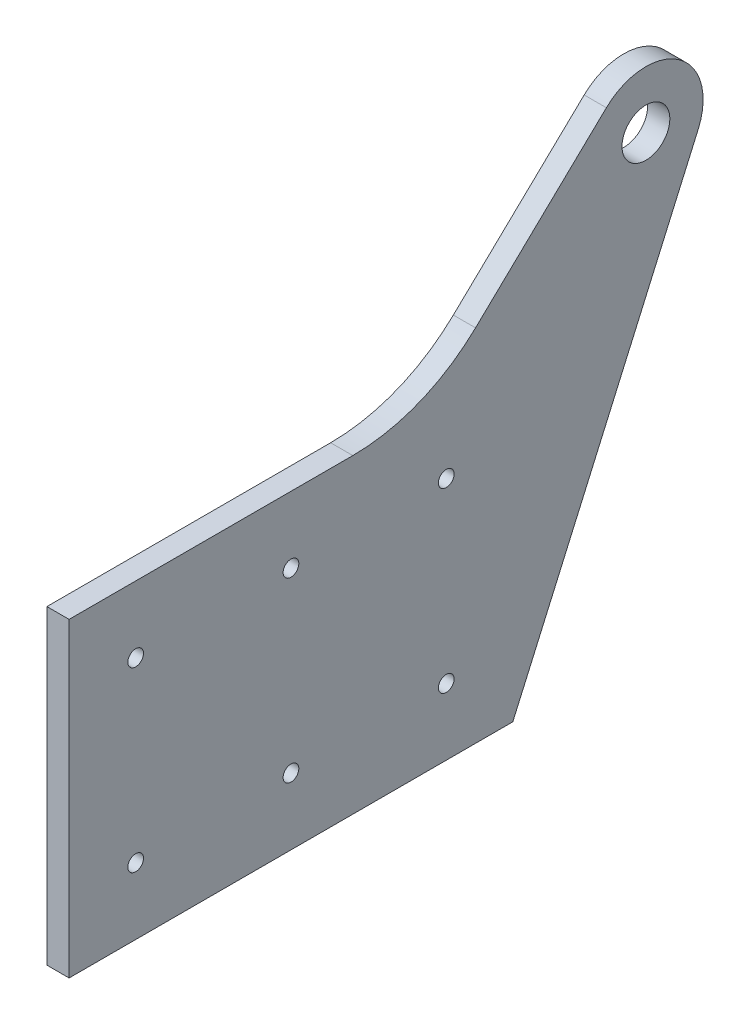
ISO-10303-21;
HEADER;
FILE_DESCRIPTION(('STEP AP214'),'2;1');
FILE_NAME('part.step','',(''),(''),'','','');
FILE_SCHEMA(('AUTOMOTIVE_DESIGN { 1 0 10303 214 1 1 1 1 }'));
ENDSEC;
DATA;
#1=APPLICATION_CONTEXT('core data for automotive mechanical design processes');
#2=APPLICATION_PROTOCOL_DEFINITION('international standard','automotive_design',2000,#1);
#3=PRODUCT_CONTEXT('',#1,'mechanical');
#4=PRODUCT('Part','Part','',(#3));
#5=PRODUCT_RELATED_PRODUCT_CATEGORY('part','',(#4));
#6=PRODUCT_DEFINITION_FORMATION('','',#4);
#7=PRODUCT_DEFINITION_CONTEXT('part definition',#1,'design');
#8=PRODUCT_DEFINITION('design','',#6,#7);
#9=PRODUCT_DEFINITION_SHAPE('','',#8);
#10=(LENGTH_UNIT() NAMED_UNIT(*) SI_UNIT(.MILLI.,.METRE.));
#11=(NAMED_UNIT(*) PLANE_ANGLE_UNIT() SI_UNIT($,.RADIAN.));
#12=(NAMED_UNIT(*) SI_UNIT($,.STERADIAN.) SOLID_ANGLE_UNIT());
#13=UNCERTAINTY_MEASURE_WITH_UNIT(LENGTH_MEASURE(1.E-05),#10,'distance_accuracy_value','');
#14=(GEOMETRIC_REPRESENTATION_CONTEXT(3) GLOBAL_UNCERTAINTY_ASSIGNED_CONTEXT((#13)) GLOBAL_UNIT_ASSIGNED_CONTEXT((#10,
#11,#12)) REPRESENTATION_CONTEXT('',''));
#15=CARTESIAN_POINT('',(0.,0.,0.));
#16=DIRECTION('',(0.,0.,1.));
#17=DIRECTION('',(1.,0.,0.));
#18=AXIS2_PLACEMENT_3D('',#15,#16,#17);
#19=CARTESIAN_POINT('',(12.827,0.,0.));
#20=DIRECTION('',(1.,0.,0.));
#21=DIRECTION('',(0.,0.,-1.));
#22=AXIS2_PLACEMENT_3D('',#19,#20,#21);
#23=PLANE('',#22);
#24=CARTESIAN_POINT('',(12.827,-57.15,146.05));
#25=DIRECTION('',(-1.,0.,0.));
#26=DIRECTION('',(0.,0.,1.));
#27=AXIS2_PLACEMENT_3D('',#24,#25,#26);
#28=CIRCLE('',#27,2.24789999999998);
#29=CARTESIAN_POINT('',(12.827,-57.15,148.2979));
#30=VERTEX_POINT('',#29);
#31=EDGE_CURVE('E214',#30,#30,#28,.T.);
#32=ORIENTED_EDGE('',*,*,#31,.T.);
#33=EDGE_LOOP('',(#32));
#34=FACE_BOUND('',#33,.T.);
#35=CARTESIAN_POINT('',(12.827,-107.95,146.05));
#36=DIRECTION('',(-1.,0.,0.));
#37=DIRECTION('',(0.,0.,1.));
#38=AXIS2_PLACEMENT_3D('',#35,#36,#37);
#39=CIRCLE('',#38,2.24789999999998);
#40=CARTESIAN_POINT('',(12.827,-107.95,148.2979));
#41=VERTEX_POINT('',#40);
#42=EDGE_CURVE('E205',#41,#41,#39,.T.);
#43=ORIENTED_EDGE('',*,*,#42,.T.);
#44=EDGE_LOOP('',(#43));
#45=FACE_BOUND('',#44,.T.);
#46=CARTESIAN_POINT('',(12.827,-107.95,101.6));
#47=DIRECTION('',(-1.,0.,0.));
#48=DIRECTION('',(0.,0.,1.));
#49=AXIS2_PLACEMENT_3D('',#46,#47,#48);
#50=CIRCLE('',#49,2.24789999999998);
#51=CARTESIAN_POINT('',(12.827,-107.95,103.8479));
#52=VERTEX_POINT('',#51);
#53=EDGE_CURVE('E196',#52,#52,#50,.T.);
#54=ORIENTED_EDGE('',*,*,#53,.T.);
#55=EDGE_LOOP('',(#54));
#56=FACE_BOUND('',#55,.T.);
#57=CARTESIAN_POINT('',(12.827,-107.95,57.15));
#58=DIRECTION('',(-1.,0.,0.));
#59=DIRECTION('',(0.,0.,1.));
#60=AXIS2_PLACEMENT_3D('',#57,#58,#59);
#61=CIRCLE('',#60,2.24789999999998);
#62=CARTESIAN_POINT('',(12.827,-107.95,59.3979));
#63=VERTEX_POINT('',#62);
#64=EDGE_CURVE('E187',#63,#63,#61,.T.);
#65=ORIENTED_EDGE('',*,*,#64,.T.);
#66=EDGE_LOOP('',(#65));
#67=FACE_BOUND('',#66,.T.);
#68=CARTESIAN_POINT('',(12.827,-57.15,101.6));
#69=DIRECTION('',(-1.,0.,0.));
#70=DIRECTION('',(0.,0.,1.));
#71=AXIS2_PLACEMENT_3D('',#68,#69,#70);
#72=CIRCLE('',#71,2.24789999999998);
#73=CARTESIAN_POINT('',(12.827,-57.15,103.8479));
#74=VERTEX_POINT('',#73);
#75=EDGE_CURVE('E178',#74,#74,#72,.T.);
#76=ORIENTED_EDGE('',*,*,#75,.T.);
#77=EDGE_LOOP('',(#76));
#78=FACE_BOUND('',#77,.T.);
#79=CARTESIAN_POINT('',(12.827,-57.15,57.15));
#80=DIRECTION('',(-1.,0.,0.));
#81=DIRECTION('',(0.,0.,1.));
#82=AXIS2_PLACEMENT_3D('',#79,#80,#81);
#83=CIRCLE('',#82,2.24789999999998);
#84=CARTESIAN_POINT('',(12.827,-57.15,59.3979));
#85=VERTEX_POINT('',#84);
#86=EDGE_CURVE('E167',#85,#85,#83,.T.);
#87=ORIENTED_EDGE('',*,*,#86,.T.);
#88=EDGE_LOOP('',(#87));
#89=FACE_BOUND('',#88,.T.);
#90=DIRECTION('',(0.,0.915006554161746,-0.403438974122539));
#91=VECTOR('',#90,1.);
#92=CARTESIAN_POINT('',(12.827,-127.,38.1));
#93=LINE('',#92,#91);
#94=CARTESIAN_POINT('',(12.827,-127.,38.1));
#95=VERTEX_POINT('',#94);
#96=CARTESIAN_POINT('',(12.827,-6.60631320125658,-14.9832323243986));
#97=VERTEX_POINT('',#96);
#98=EDGE_CURVE('E140',#95,#97,#93,.T.);
#99=ORIENTED_EDGE('',*,*,#98,.T.);
#100=CARTESIAN_POINT('',(12.827,0.,0.));
#101=DIRECTION('',(1.,0.,0.));
#102=DIRECTION('',(0.,0.,-1.));
#103=AXIS2_PLACEMENT_3D('',#100,#101,#102);
#104=CIRCLE('',#103,16.375);
#105=CARTESIAN_POINT('',(12.827,11.8309066911241,11.3212310225485));
#106=VERTEX_POINT('',#105);
#107=EDGE_CURVE('E93',#97,#106,#104,.T.);
#108=ORIENTED_EDGE('',*,*,#107,.T.);
#109=DIRECTION('',(0.,-0.69137288687319,0.722498118541931));
#110=VECTOR('',#109,1.);
#111=CARTESIAN_POINT('',(12.827,-24.0029044219301,48.7682608394948));
#112=LINE('',#111,#110);
#113=CARTESIAN_POINT('',(12.827,-24.0029044219301,48.7682608394949));
#114=VERTEX_POINT('',#113);
#115=EDGE_CURVE('E152',#106,#114,#112,.T.);
#116=ORIENTED_EDGE('',*,*,#115,.T.);
#117=CARTESIAN_POINT('',(12.827,12.7,83.8900034926529));
#118=DIRECTION('',(-1.,0.,0.));
#119=DIRECTION('',(0.,0.,-1.));
#120=AXIS2_PLACEMENT_3D('',#117,#118,#119);
#121=CIRCLE('',#120,50.8);
#122=CARTESIAN_POINT('',(12.827,-38.1,83.8900034926529));
#123=VERTEX_POINT('',#122);
#124=EDGE_CURVE('E109',#114,#123,#121,.T.);
#125=ORIENTED_EDGE('',*,*,#124,.T.);
#126=DIRECTION('',(0.,0.,1.));
#127=VECTOR('',#126,1.);
#128=CARTESIAN_POINT('',(12.827,-38.1,165.1));
#129=LINE('',#128,#127);
#130=CARTESIAN_POINT('',(12.827,-38.1,165.1));
#131=VERTEX_POINT('',#130);
#132=EDGE_CURVE('E103',#123,#131,#129,.T.);
#133=ORIENTED_EDGE('',*,*,#132,.T.);
#134=DIRECTION('',(0.,-1.,0.));
#135=VECTOR('',#134,1.);
#136=CARTESIAN_POINT('',(12.827,-127.,165.1));
#137=LINE('',#136,#135);
#138=CARTESIAN_POINT('',(12.827,-127.,165.1));
#139=VERTEX_POINT('',#138);
#140=EDGE_CURVE('E107',#131,#139,#137,.T.);
#141=ORIENTED_EDGE('',*,*,#140,.T.);
#142=DIRECTION('',(0.,0.,-1.));
#143=VECTOR('',#142,1.);
#144=CARTESIAN_POINT('',(12.827,-127.,38.1));
#145=LINE('',#144,#143);
#146=EDGE_CURVE('E53',#139,#95,#145,.T.);
#147=ORIENTED_EDGE('',*,*,#146,.T.);
#148=EDGE_LOOP('',(#99,#108,#116,#125,#133,#141,#147));
#149=FACE_BOUND('',#148,.T.);
#150=CARTESIAN_POINT('',(12.827,0.,0.));
#151=DIRECTION('',(1.,0.,0.));
#152=DIRECTION('',(0.,0.,-1.));
#153=AXIS2_PLACEMENT_3D('',#150,#151,#152);
#154=CIRCLE('',#153,6.85);
#155=CARTESIAN_POINT('',(12.827,0.,-6.85));
#156=VERTEX_POINT('',#155);
#157=EDGE_CURVE('E131',#156,#156,#154,.T.);
#158=ORIENTED_EDGE('',*,*,#157,.F.);
#159=EDGE_LOOP('',(#158));
#160=FACE_BOUND('',#159,.T.);
#161=ADVANCED_FACE('F36',(#34,#45,#56,#67,#78,#89,#149,#160),#23,.T.);
#162=CARTESIAN_POINT('',(6.477,0.,0.));
#163=DIRECTION('',(1.,0.,0.));
#164=DIRECTION('',(0.,0.,-1.));
#165=AXIS2_PLACEMENT_3D('',#162,#163,#164);
#166=PLANE('',#165);
#167=CARTESIAN_POINT('',(6.477,-57.15,146.05));
#168=DIRECTION('',(-1.,0.,0.));
#169=DIRECTION('',(0.,0.,1.));
#170=AXIS2_PLACEMENT_3D('',#167,#168,#169);
#171=CIRCLE('',#170,4.2164);
#172=CARTESIAN_POINT('',(6.477,-57.15,150.2664));
#173=VERTEX_POINT('',#172);
#174=EDGE_CURVE('E220',#173,#173,#171,.T.);
#175=ORIENTED_EDGE('',*,*,#174,.F.);
#176=EDGE_LOOP('',(#175));
#177=FACE_BOUND('',#176,.T.);
#178=CARTESIAN_POINT('',(6.477,-107.95,146.05));
#179=DIRECTION('',(-1.,0.,0.));
#180=DIRECTION('',(0.,0.,1.));
#181=AXIS2_PLACEMENT_3D('',#178,#179,#180);
#182=CIRCLE('',#181,4.21639999999999);
#183=CARTESIAN_POINT('',(6.477,-107.95,150.2664));
#184=VERTEX_POINT('',#183);
#185=EDGE_CURVE('E211',#184,#184,#182,.T.);
#186=ORIENTED_EDGE('',*,*,#185,.F.);
#187=EDGE_LOOP('',(#186));
#188=FACE_BOUND('',#187,.T.);
#189=CARTESIAN_POINT('',(6.477,-107.95,101.6));
#190=DIRECTION('',(-1.,0.,0.));
#191=DIRECTION('',(0.,0.,1.));
#192=AXIS2_PLACEMENT_3D('',#189,#190,#191);
#193=CIRCLE('',#192,4.21639999999999);
#194=CARTESIAN_POINT('',(6.477,-107.95,105.8164));
#195=VERTEX_POINT('',#194);
#196=EDGE_CURVE('E202',#195,#195,#193,.T.);
#197=ORIENTED_EDGE('',*,*,#196,.F.);
#198=EDGE_LOOP('',(#197));
#199=FACE_BOUND('',#198,.T.);
#200=CARTESIAN_POINT('',(6.477,-107.95,57.15));
#201=DIRECTION('',(-1.,0.,0.));
#202=DIRECTION('',(0.,0.,1.));
#203=AXIS2_PLACEMENT_3D('',#200,#201,#202);
#204=CIRCLE('',#203,4.21639999999999);
#205=CARTESIAN_POINT('',(6.477,-107.95,61.3664));
#206=VERTEX_POINT('',#205);
#207=EDGE_CURVE('E193',#206,#206,#204,.T.);
#208=ORIENTED_EDGE('',*,*,#207,.F.);
#209=EDGE_LOOP('',(#208));
#210=FACE_BOUND('',#209,.T.);
#211=CARTESIAN_POINT('',(6.477,-57.15,101.6));
#212=DIRECTION('',(-1.,0.,0.));
#213=DIRECTION('',(0.,0.,1.));
#214=AXIS2_PLACEMENT_3D('',#211,#212,#213);
#215=CIRCLE('',#214,4.2164);
#216=CARTESIAN_POINT('',(6.477,-57.15,105.8164));
#217=VERTEX_POINT('',#216);
#218=EDGE_CURVE('E184',#217,#217,#215,.T.);
#219=ORIENTED_EDGE('',*,*,#218,.F.);
#220=EDGE_LOOP('',(#219));
#221=FACE_BOUND('',#220,.T.);
#222=CARTESIAN_POINT('',(6.477,-57.15,57.15));
#223=DIRECTION('',(-1.,0.,0.));
#224=DIRECTION('',(0.,0.,1.));
#225=AXIS2_PLACEMENT_3D('',#222,#223,#224);
#226=CIRCLE('',#225,4.2164);
#227=CARTESIAN_POINT('',(6.477,-57.15,61.3664));
#228=VERTEX_POINT('',#227);
#229=EDGE_CURVE('E175',#228,#228,#226,.T.);
#230=ORIENTED_EDGE('',*,*,#229,.F.);
#231=EDGE_LOOP('',(#230));
#232=FACE_BOUND('',#231,.T.);
#233=DIRECTION('',(0.,0.915006554161746,-0.403438974122539));
#234=VECTOR('',#233,1.);
#235=CARTESIAN_POINT('',(6.477,-127.,38.1));
#236=LINE('',#235,#234);
#237=CARTESIAN_POINT('',(6.477,-127.,38.1));
#238=VERTEX_POINT('',#237);
#239=CARTESIAN_POINT('',(6.477,-6.60631320125658,-14.9832323243986));
#240=VERTEX_POINT('',#239);
#241=EDGE_CURVE('E127',#238,#240,#236,.T.);
#242=ORIENTED_EDGE('',*,*,#241,.F.);
#243=DIRECTION('',(0.,0.,-1.));
#244=VECTOR('',#243,1.);
#245=CARTESIAN_POINT('',(6.477,-127.,38.1));
#246=LINE('',#245,#244);
#247=CARTESIAN_POINT('',(6.477,-127.,165.1));
#248=VERTEX_POINT('',#247);
#249=EDGE_CURVE('E85',#248,#238,#246,.T.);
#250=ORIENTED_EDGE('',*,*,#249,.F.);
#251=DIRECTION('',(0.,-1.,0.));
#252=VECTOR('',#251,1.);
#253=CARTESIAN_POINT('',(6.477,-127.,165.1));
#254=LINE('',#253,#252);
#255=CARTESIAN_POINT('',(6.477,-38.1,165.1));
#256=VERTEX_POINT('',#255);
#257=EDGE_CURVE('E79',#256,#248,#254,.T.);
#258=ORIENTED_EDGE('',*,*,#257,.F.);
#259=DIRECTION('',(0.,0.,1.));
#260=VECTOR('',#259,1.);
#261=CARTESIAN_POINT('',(6.477,-38.1,165.1));
#262=LINE('',#261,#260);
#263=CARTESIAN_POINT('',(6.477,-38.1,83.8900034926529));
#264=VERTEX_POINT('',#263);
#265=EDGE_CURVE('E117',#264,#256,#262,.T.);
#266=ORIENTED_EDGE('',*,*,#265,.F.);
#267=CARTESIAN_POINT('',(6.477,12.7,83.8900034926529));
#268=DIRECTION('',(-1.,0.,0.));
#269=DIRECTION('',(0.,0.,-1.));
#270=AXIS2_PLACEMENT_3D('',#267,#268,#269);
#271=CIRCLE('',#270,50.8);
#272=CARTESIAN_POINT('',(6.477,-24.0029044219301,48.7682608394949));
#273=VERTEX_POINT('',#272);
#274=EDGE_CURVE('E135',#273,#264,#271,.T.);
#275=ORIENTED_EDGE('',*,*,#274,.F.);
#276=DIRECTION('',(0.,-0.69137288687319,0.722498118541931));
#277=VECTOR('',#276,1.);
#278=CARTESIAN_POINT('',(6.477,-24.0029044219301,48.7682608394948));
#279=LINE('',#278,#277);
#280=CARTESIAN_POINT('',(6.477,11.8309066911241,11.3212310225485));
#281=VERTEX_POINT('',#280);
#282=EDGE_CURVE('E133',#281,#273,#279,.T.);
#283=ORIENTED_EDGE('',*,*,#282,.F.);
#284=CARTESIAN_POINT('',(6.477,0.,0.));
#285=DIRECTION('',(1.,0.,0.));
#286=DIRECTION('',(0.,0.,-1.));
#287=AXIS2_PLACEMENT_3D('',#284,#285,#286);
#288=CIRCLE('',#287,16.375);
#289=EDGE_CURVE('E130',#240,#281,#288,.T.);
#290=ORIENTED_EDGE('',*,*,#289,.F.);
#291=EDGE_LOOP('',(#242,#250,#258,#266,#275,#283,#290));
#292=FACE_BOUND('',#291,.T.);
#293=CARTESIAN_POINT('',(6.477,0.,0.));
#294=DIRECTION('',(1.,0.,0.));
#295=DIRECTION('',(0.,0.,-1.));
#296=AXIS2_PLACEMENT_3D('',#293,#294,#295);
#297=CIRCLE('',#296,6.85);
#298=CARTESIAN_POINT('',(6.477,0.,-6.85));
#299=VERTEX_POINT('',#298);
#300=EDGE_CURVE('E164',#299,#299,#297,.T.);
#301=ORIENTED_EDGE('',*,*,#300,.T.);
#302=EDGE_LOOP('',(#301));
#303=FACE_BOUND('',#302,.T.);
#304=ADVANCED_FACE('F156',(#177,#188,#199,#210,#221,#232,#292,#303),#166,.F.);
#305=CARTESIAN_POINT('',(12.827,-127.,38.1));
#306=DIRECTION('',(0.,0.403438974122539,0.915006554161746));
#307=DIRECTION('',(0.,-0.915006554161746,0.40343897412254));
#308=AXIS2_PLACEMENT_3D('',#305,#306,#307);
#309=PLANE('',#308);
#310=ORIENTED_EDGE('',*,*,#241,.T.);
#311=DIRECTION('',(-1.,0.,0.));
#312=VECTOR('',#311,1.);
#313=CARTESIAN_POINT('',(12.827,-6.60631320125658,-14.9832323243986));
#314=LINE('',#313,#312);
#315=EDGE_CURVE('E11',#97,#240,#314,.T.);
#316=ORIENTED_EDGE('',*,*,#315,.F.);
#317=ORIENTED_EDGE('',*,*,#98,.F.);
#318=DIRECTION('',(-1.,0.,0.));
#319=VECTOR('',#318,1.);
#320=CARTESIAN_POINT('',(12.827,-127.,38.1));
#321=LINE('',#320,#319);
#322=EDGE_CURVE('E123',#95,#238,#321,.T.);
#323=ORIENTED_EDGE('',*,*,#322,.T.);
#324=EDGE_LOOP('',(#310,#316,#317,#323));
#325=FACE_BOUND('',#324,.T.);
#326=ADVANCED_FACE('F38',(#325),#309,.F.);
#327=CARTESIAN_POINT('',(12.827,0.,0.));
#328=DIRECTION('',(-1.,0.,0.));
#329=DIRECTION('',(0.,0.,1.));
#330=AXIS2_PLACEMENT_3D('',#327,#328,#329);
#331=CYLINDRICAL_SURFACE('',#330,16.375);
#332=ORIENTED_EDGE('',*,*,#289,.T.);
#333=DIRECTION('',(-1.,0.,0.));
#334=VECTOR('',#333,1.);
#335=CARTESIAN_POINT('',(12.827,11.8309066911241,11.3212310225485));
#336=LINE('',#335,#334);
#337=EDGE_CURVE('E45',#106,#281,#336,.T.);
#338=ORIENTED_EDGE('',*,*,#337,.F.);
#339=ORIENTED_EDGE('',*,*,#107,.F.);
#340=ORIENTED_EDGE('',*,*,#315,.T.);
#341=EDGE_LOOP('',(#332,#338,#339,#340));
#342=FACE_BOUND('',#341,.T.);
#343=ADVANCED_FACE('F274',(#342),#331,.T.);
#344=CARTESIAN_POINT('',(12.827,-24.0029044219301,48.7682608394948));
#345=DIRECTION('',(0.,-0.722498118541932,-0.69137288687319));
#346=DIRECTION('',(0.,0.69137288687319,-0.722498118541932));
#347=AXIS2_PLACEMENT_3D('',#344,#345,#346);
#348=PLANE('',#347);
#349=ORIENTED_EDGE('',*,*,#282,.T.);
#350=DIRECTION('',(-1.,0.,0.));
#351=VECTOR('',#350,1.);
#352=CARTESIAN_POINT('',(12.827,-24.0029044219301,48.7682608394949));
#353=LINE('',#352,#351);
#354=EDGE_CURVE('E144',#114,#273,#353,.T.);
#355=ORIENTED_EDGE('',*,*,#354,.F.);
#356=ORIENTED_EDGE('',*,*,#115,.F.);
#357=ORIENTED_EDGE('',*,*,#337,.T.);
#358=EDGE_LOOP('',(#349,#355,#356,#357));
#359=FACE_BOUND('',#358,.T.);
#360=ADVANCED_FACE('F150',(#359),#348,.F.);
#361=CARTESIAN_POINT('',(12.827,12.7,83.8900034926529));
#362=DIRECTION('',(-1.,0.,0.));
#363=DIRECTION('',(0.,0.,1.));
#364=AXIS2_PLACEMENT_3D('',#361,#362,#363);
#365=CYLINDRICAL_SURFACE('',#364,50.8);
#366=ORIENTED_EDGE('',*,*,#274,.T.);
#367=DIRECTION('',(-1.,0.,0.));
#368=VECTOR('',#367,1.);
#369=CARTESIAN_POINT('',(12.827,-38.1,83.8900034926529));
#370=LINE('',#369,#368);
#371=EDGE_CURVE('E118',#123,#264,#370,.T.);
#372=ORIENTED_EDGE('',*,*,#371,.F.);
#373=ORIENTED_EDGE('',*,*,#124,.F.);
#374=ORIENTED_EDGE('',*,*,#354,.T.);
#375=EDGE_LOOP('',(#366,#372,#373,#374));
#376=FACE_BOUND('',#375,.T.);
#377=ADVANCED_FACE('F159',(#376),#365,.F.);
#378=CARTESIAN_POINT('',(12.827,-38.1,165.1));
#379=DIRECTION('',(0.,-1.,0.));
#380=DIRECTION('',(0.,0.,-1.));
#381=AXIS2_PLACEMENT_3D('',#378,#379,#380);
#382=PLANE('',#381);
#383=ORIENTED_EDGE('',*,*,#265,.T.);
#384=DIRECTION('',(-1.,0.,0.));
#385=VECTOR('',#384,1.);
#386=CARTESIAN_POINT('',(12.827,-38.1,165.1));
#387=LINE('',#386,#385);
#388=EDGE_CURVE('E114',#131,#256,#387,.T.);
#389=ORIENTED_EDGE('',*,*,#388,.F.);
#390=ORIENTED_EDGE('',*,*,#132,.F.);
#391=ORIENTED_EDGE('',*,*,#371,.T.);
#392=EDGE_LOOP('',(#383,#389,#390,#391));
#393=FACE_BOUND('',#392,.T.);
#394=ADVANCED_FACE('F115',(#393),#382,.F.);
#395=CARTESIAN_POINT('',(12.827,-127.,165.1));
#396=DIRECTION('',(0.,0.,-1.));
#397=DIRECTION('',(-1.,0.,0.));
#398=AXIS2_PLACEMENT_3D('',#395,#396,#397);
#399=PLANE('',#398);
#400=ORIENTED_EDGE('',*,*,#257,.T.);
#401=DIRECTION('',(-1.,0.,0.));
#402=VECTOR('',#401,1.);
#403=CARTESIAN_POINT('',(12.827,-127.,165.1));
#404=LINE('',#403,#402);
#405=EDGE_CURVE('E119',#139,#248,#404,.T.);
#406=ORIENTED_EDGE('',*,*,#405,.F.);
#407=ORIENTED_EDGE('',*,*,#140,.F.);
#408=ORIENTED_EDGE('',*,*,#388,.T.);
#409=EDGE_LOOP('',(#400,#406,#407,#408));
#410=FACE_BOUND('',#409,.T.);
#411=ADVANCED_FACE('F121',(#410),#399,.F.);
#412=CARTESIAN_POINT('',(12.827,-127.,38.1));
#413=DIRECTION('',(0.,1.,0.));
#414=DIRECTION('',(0.,0.,1.));
#415=AXIS2_PLACEMENT_3D('',#412,#413,#414);
#416=PLANE('',#415);
#417=ORIENTED_EDGE('',*,*,#249,.T.);
#418=ORIENTED_EDGE('',*,*,#322,.F.);
#419=ORIENTED_EDGE('',*,*,#146,.F.);
#420=ORIENTED_EDGE('',*,*,#405,.T.);
#421=EDGE_LOOP('',(#417,#418,#419,#420));
#422=FACE_BOUND('',#421,.T.);
#423=ADVANCED_FACE('F264',(#422),#416,.F.);
#424=CARTESIAN_POINT('',(12.827,0.,0.));
#425=DIRECTION('',(-1.,0.,0.));
#426=DIRECTION('',(0.,0.,1.));
#427=AXIS2_PLACEMENT_3D('',#424,#425,#426);
#428=CYLINDRICAL_SURFACE('',#427,6.85);
#429=ORIENTED_EDGE('',*,*,#157,.T.);
#430=EDGE_LOOP('',(#429));
#431=FACE_BOUND('',#430,.T.);
#432=ORIENTED_EDGE('',*,*,#300,.F.);
#433=EDGE_LOOP('',(#432));
#434=FACE_BOUND('',#433,.T.);
#435=ADVANCED_FACE('F252',(#431,#434),#428,.F.);
#436=CARTESIAN_POINT('',(6.477,-57.15,57.15));
#437=DIRECTION('',(-1.,0.,0.));
#438=DIRECTION('',(0.,0.,1.));
#439=AXIS2_PLACEMENT_3D('',#436,#437,#438);
#440=CYLINDRICAL_SURFACE('',#439,2.24789999999999);
#441=ORIENTED_EDGE('',*,*,#86,.F.);
#442=EDGE_LOOP('',(#441));
#443=FACE_BOUND('',#442,.T.);
#444=CARTESIAN_POINT('',(8.12876762397248,-57.15,57.15));
#445=DIRECTION('',(-1.,0.,0.));
#446=DIRECTION('',(0.,0.,1.));
#447=AXIS2_PLACEMENT_3D('',#444,#445,#446);
#448=CIRCLE('',#447,2.2479);
#449=CARTESIAN_POINT('',(8.12876762397248,-57.15,59.3979));
#450=VERTEX_POINT('',#449);
#451=EDGE_CURVE('E172',#450,#450,#448,.T.);
#452=ORIENTED_EDGE('',*,*,#451,.T.);
#453=EDGE_LOOP('',(#452));
#454=FACE_BOUND('',#453,.T.);
#455=ADVANCED_FACE('F242',(#443,#454),#440,.F.);
#456=CARTESIAN_POINT('',(6.477,-57.15,57.15));
#457=DIRECTION('',(-1.,0.,0.));
#458=DIRECTION('',(0.,0.,1.));
#459=AXIS2_PLACEMENT_3D('',#456,#457,#458);
#460=CONICAL_SURFACE('',#459,4.2164,0.872664625997165);
#461=ORIENTED_EDGE('',*,*,#451,.F.);
#462=EDGE_LOOP('',(#461));
#463=FACE_BOUND('',#462,.T.);
#464=ORIENTED_EDGE('',*,*,#229,.T.);
#465=EDGE_LOOP('',(#464));
#466=FACE_BOUND('',#465,.T.);
#467=ADVANCED_FACE('F239',(#463,#466),#460,.F.);
#468=CARTESIAN_POINT('',(6.477,-57.15,101.6));
#469=DIRECTION('',(-1.,0.,0.));
#470=DIRECTION('',(0.,0.,1.));
#471=AXIS2_PLACEMENT_3D('',#468,#469,#470);
#472=CYLINDRICAL_SURFACE('',#471,2.24789999999999);
#473=ORIENTED_EDGE('',*,*,#75,.F.);
#474=EDGE_LOOP('',(#473));
#475=FACE_BOUND('',#474,.T.);
#476=CARTESIAN_POINT('',(8.12876762397248,-57.15,101.6));
#477=DIRECTION('',(-1.,0.,0.));
#478=DIRECTION('',(0.,0.,1.));
#479=AXIS2_PLACEMENT_3D('',#476,#477,#478);
#480=CIRCLE('',#479,2.2479);
#481=CARTESIAN_POINT('',(8.12876762397248,-57.15,103.8479));
#482=VERTEX_POINT('',#481);
#483=EDGE_CURVE('E181',#482,#482,#480,.T.);
#484=ORIENTED_EDGE('',*,*,#483,.T.);
#485=EDGE_LOOP('',(#484));
#486=FACE_BOUND('',#485,.T.);
#487=ADVANCED_FACE('F241',(#475,#486),#472,.F.);
#488=CARTESIAN_POINT('',(6.477,-57.15,101.6));
#489=DIRECTION('',(-1.,0.,0.));
#490=DIRECTION('',(0.,0.,1.));
#491=AXIS2_PLACEMENT_3D('',#488,#489,#490);
#492=CONICAL_SURFACE('',#491,4.2164,0.872664625997165);
#493=ORIENTED_EDGE('',*,*,#483,.F.);
#494=EDGE_LOOP('',(#493));
#495=FACE_BOUND('',#494,.T.);
#496=ORIENTED_EDGE('',*,*,#218,.T.);
#497=EDGE_LOOP('',(#496));
#498=FACE_BOUND('',#497,.T.);
#499=ADVANCED_FACE('F249',(#495,#498),#492,.F.);
#500=CARTESIAN_POINT('',(6.477,-107.95,57.15));
#501=DIRECTION('',(-1.,0.,0.));
#502=DIRECTION('',(0.,0.,1.));
#503=AXIS2_PLACEMENT_3D('',#500,#501,#502);
#504=CYLINDRICAL_SURFACE('',#503,2.24789999999999);
#505=ORIENTED_EDGE('',*,*,#64,.F.);
#506=EDGE_LOOP('',(#505));
#507=FACE_BOUND('',#506,.T.);
#508=CARTESIAN_POINT('',(8.12876762397248,-107.95,57.15));
#509=DIRECTION('',(-1.,0.,0.));
#510=DIRECTION('',(0.,0.,1.));
#511=AXIS2_PLACEMENT_3D('',#508,#509,#510);
#512=CIRCLE('',#511,2.2479);
#513=CARTESIAN_POINT('',(8.12876762397248,-107.95,59.3979));
#514=VERTEX_POINT('',#513);
#515=EDGE_CURVE('E190',#514,#514,#512,.T.);
#516=ORIENTED_EDGE('',*,*,#515,.T.);
#517=EDGE_LOOP('',(#516));
#518=FACE_BOUND('',#517,.T.);
#519=ADVANCED_FACE('F344',(#507,#518),#504,.F.);
#520=CARTESIAN_POINT('',(6.477,-107.95,57.15));
#521=DIRECTION('',(-1.,0.,0.));
#522=DIRECTION('',(0.,0.,1.));
#523=AXIS2_PLACEMENT_3D('',#520,#521,#522);
#524=CONICAL_SURFACE('',#523,4.21639999999999,0.872664625997163);
#525=ORIENTED_EDGE('',*,*,#515,.F.);
#526=EDGE_LOOP('',(#525));
#527=FACE_BOUND('',#526,.T.);
#528=ORIENTED_EDGE('',*,*,#207,.T.);
#529=EDGE_LOOP('',(#528));
#530=FACE_BOUND('',#529,.T.);
#531=ADVANCED_FACE('F354',(#527,#530),#524,.F.);
#532=CARTESIAN_POINT('',(6.477,-107.95,101.6));
#533=DIRECTION('',(-1.,0.,0.));
#534=DIRECTION('',(0.,0.,1.));
#535=AXIS2_PLACEMENT_3D('',#532,#533,#534);
#536=CYLINDRICAL_SURFACE('',#535,2.24789999999999);
#537=ORIENTED_EDGE('',*,*,#53,.F.);
#538=EDGE_LOOP('',(#537));
#539=FACE_BOUND('',#538,.T.);
#540=CARTESIAN_POINT('',(8.12876762397248,-107.95,101.6));
#541=DIRECTION('',(-1.,0.,0.));
#542=DIRECTION('',(0.,0.,1.));
#543=AXIS2_PLACEMENT_3D('',#540,#541,#542);
#544=CIRCLE('',#543,2.2479);
#545=CARTESIAN_POINT('',(8.12876762397248,-107.95,103.8479));
#546=VERTEX_POINT('',#545);
#547=EDGE_CURVE('E199',#546,#546,#544,.T.);
#548=ORIENTED_EDGE('',*,*,#547,.T.);
#549=EDGE_LOOP('',(#548));
#550=FACE_BOUND('',#549,.T.);
#551=ADVANCED_FACE('F363',(#539,#550),#536,.F.);
#552=CARTESIAN_POINT('',(6.477,-107.95,101.6));
#553=DIRECTION('',(-1.,0.,0.));
#554=DIRECTION('',(0.,0.,1.));
#555=AXIS2_PLACEMENT_3D('',#552,#553,#554);
#556=CONICAL_SURFACE('',#555,4.21639999999999,0.872664625997163);
#557=ORIENTED_EDGE('',*,*,#547,.F.);
#558=EDGE_LOOP('',(#557));
#559=FACE_BOUND('',#558,.T.);
#560=ORIENTED_EDGE('',*,*,#196,.T.);
#561=EDGE_LOOP('',(#560));
#562=FACE_BOUND('',#561,.T.);
#563=ADVANCED_FACE('F372',(#559,#562),#556,.F.);
#564=CARTESIAN_POINT('',(6.477,-107.95,146.05));
#565=DIRECTION('',(-1.,0.,0.));
#566=DIRECTION('',(0.,0.,1.));
#567=AXIS2_PLACEMENT_3D('',#564,#565,#566);
#568=CYLINDRICAL_SURFACE('',#567,2.24789999999999);
#569=ORIENTED_EDGE('',*,*,#42,.F.);
#570=EDGE_LOOP('',(#569));
#571=FACE_BOUND('',#570,.T.);
#572=CARTESIAN_POINT('',(8.12876762397248,-107.95,146.05));
#573=DIRECTION('',(-1.,0.,0.));
#574=DIRECTION('',(0.,0.,1.));
#575=AXIS2_PLACEMENT_3D('',#572,#573,#574);
#576=CIRCLE('',#575,2.2479);
#577=CARTESIAN_POINT('',(8.12876762397248,-107.95,148.2979));
#578=VERTEX_POINT('',#577);
#579=EDGE_CURVE('E208',#578,#578,#576,.T.);
#580=ORIENTED_EDGE('',*,*,#579,.T.);
#581=EDGE_LOOP('',(#580));
#582=FACE_BOUND('',#581,.T.);
#583=ADVANCED_FACE('F381',(#571,#582),#568,.F.);
#584=CARTESIAN_POINT('',(6.477,-107.95,146.05));
#585=DIRECTION('',(-1.,0.,0.));
#586=DIRECTION('',(0.,0.,1.));
#587=AXIS2_PLACEMENT_3D('',#584,#585,#586);
#588=CONICAL_SURFACE('',#587,4.21639999999999,0.872664625997163);
#589=ORIENTED_EDGE('',*,*,#579,.F.);
#590=EDGE_LOOP('',(#589));
#591=FACE_BOUND('',#590,.T.);
#592=ORIENTED_EDGE('',*,*,#185,.T.);
#593=EDGE_LOOP('',(#592));
#594=FACE_BOUND('',#593,.T.);
#595=ADVANCED_FACE('F390',(#591,#594),#588,.F.);
#596=CARTESIAN_POINT('',(6.477,-57.15,146.05));
#597=DIRECTION('',(-1.,0.,0.));
#598=DIRECTION('',(0.,0.,1.));
#599=AXIS2_PLACEMENT_3D('',#596,#597,#598);
#600=CYLINDRICAL_SURFACE('',#599,2.24789999999999);
#601=ORIENTED_EDGE('',*,*,#31,.F.);
#602=EDGE_LOOP('',(#601));
#603=FACE_BOUND('',#602,.T.);
#604=CARTESIAN_POINT('',(8.12876762397248,-57.15,146.05));
#605=DIRECTION('',(-1.,0.,0.));
#606=DIRECTION('',(0.,0.,1.));
#607=AXIS2_PLACEMENT_3D('',#604,#605,#606);
#608=CIRCLE('',#607,2.2479);
#609=CARTESIAN_POINT('',(8.12876762397248,-57.15,148.2979));
#610=VERTEX_POINT('',#609);
#611=EDGE_CURVE('E217',#610,#610,#608,.T.);
#612=ORIENTED_EDGE('',*,*,#611,.T.);
#613=EDGE_LOOP('',(#612));
#614=FACE_BOUND('',#613,.T.);
#615=ADVANCED_FACE('F399',(#603,#614),#600,.F.);
#616=CARTESIAN_POINT('',(6.477,-57.15,146.05));
#617=DIRECTION('',(-1.,0.,0.));
#618=DIRECTION('',(0.,0.,1.));
#619=AXIS2_PLACEMENT_3D('',#616,#617,#618);
#620=CONICAL_SURFACE('',#619,4.2164,0.872664625997165);
#621=ORIENTED_EDGE('',*,*,#611,.F.);
#622=EDGE_LOOP('',(#621));
#623=FACE_BOUND('',#622,.T.);
#624=ORIENTED_EDGE('',*,*,#174,.T.);
#625=EDGE_LOOP('',(#624));
#626=FACE_BOUND('',#625,.T.);
#627=ADVANCED_FACE('F224',(#623,#626),#620,.F.);
#628=CLOSED_SHELL('',(#161,#304,#326,#343,#360,#377,#394,#411,#423,#435,#455,#467,#487,#499,
#519,#531,#551,#563,#583,#595,#615,#627));
#629=MANIFOLD_SOLID_BREP('B2',#628);
#630=ADVANCED_BREP_SHAPE_REPRESENTATION('',(#18,#629),#14);
#631=SHAPE_DEFINITION_REPRESENTATION(#9,#630);
ENDSEC;
END-ISO-10303-21;
